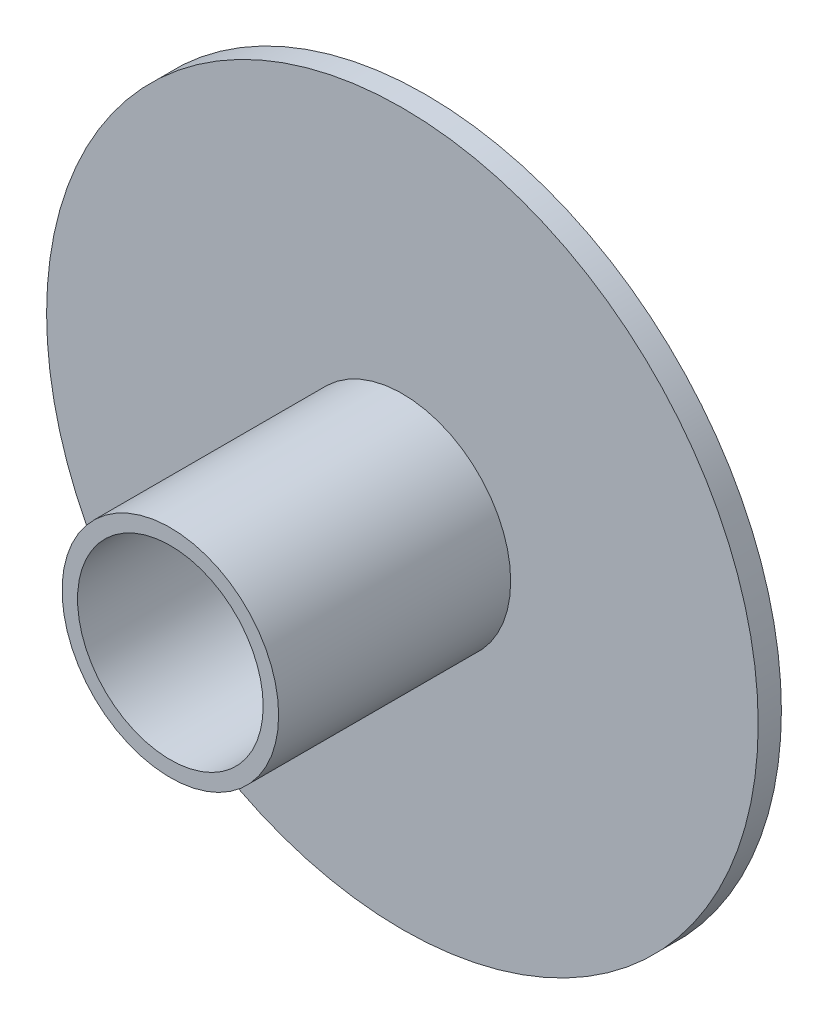
ISO-10303-21;
HEADER;
FILE_DESCRIPTION(('STEP AP214'),'2;1');
FILE_NAME('part.step','',(''),(''),'','','');
FILE_SCHEMA(('AUTOMOTIVE_DESIGN { 1 0 10303 214 1 1 1 1 }'));
ENDSEC;
DATA;
#1=APPLICATION_CONTEXT('core data for automotive mechanical design processes');
#2=APPLICATION_PROTOCOL_DEFINITION('international standard','automotive_design',2000,#1);
#3=PRODUCT_CONTEXT('',#1,'mechanical');
#4=PRODUCT('Part','Part','',(#3));
#5=PRODUCT_RELATED_PRODUCT_CATEGORY('part','',(#4));
#6=PRODUCT_DEFINITION_FORMATION('','',#4);
#7=PRODUCT_DEFINITION_CONTEXT('part definition',#1,'design');
#8=PRODUCT_DEFINITION('design','',#6,#7);
#9=PRODUCT_DEFINITION_SHAPE('','',#8);
#10=(LENGTH_UNIT() NAMED_UNIT(*) SI_UNIT(.MILLI.,.METRE.));
#11=(NAMED_UNIT(*) PLANE_ANGLE_UNIT() SI_UNIT($,.RADIAN.));
#12=(NAMED_UNIT(*) SI_UNIT($,.STERADIAN.) SOLID_ANGLE_UNIT());
#13=UNCERTAINTY_MEASURE_WITH_UNIT(LENGTH_MEASURE(1.E-05),#10,'distance_accuracy_value','');
#14=(GEOMETRIC_REPRESENTATION_CONTEXT(3) GLOBAL_UNCERTAINTY_ASSIGNED_CONTEXT((#13)) GLOBAL_UNIT_ASSIGNED_CONTEXT((#10,
#11,#12)) REPRESENTATION_CONTEXT('',''));
#15=CARTESIAN_POINT('',(0.,0.,0.));
#16=DIRECTION('',(0.,0.,1.));
#17=DIRECTION('',(1.,0.,0.));
#18=AXIS2_PLACEMENT_3D('',#15,#16,#17);
#19=CARTESIAN_POINT('',(0.,0.,1.5));
#20=DIRECTION('',(0.,0.,-1.));
#21=DIRECTION('',(-1.,0.,0.));
#22=AXIS2_PLACEMENT_3D('',#19,#20,#21);
#23=CYLINDRICAL_SURFACE('',#22,23.);
#24=CARTESIAN_POINT('',(0.,0.,1.5));
#25=DIRECTION('',(0.,0.,1.));
#26=DIRECTION('',(1.,0.,0.));
#27=AXIS2_PLACEMENT_3D('',#24,#25,#26);
#28=CIRCLE('',#27,23.);
#29=CARTESIAN_POINT('',(23.,0.,1.5));
#30=VERTEX_POINT('',#29);
#31=EDGE_CURVE('E10',#30,#30,#28,.T.);
#32=ORIENTED_EDGE('',*,*,#31,.F.);
#33=EDGE_LOOP('',(#32));
#34=FACE_BOUND('',#33,.T.);
#35=CARTESIAN_POINT('',(0.,0.,0.));
#36=DIRECTION('',(0.,0.,1.));
#37=DIRECTION('',(1.,0.,0.));
#38=AXIS2_PLACEMENT_3D('',#35,#36,#37);
#39=CIRCLE('',#38,23.);
#40=CARTESIAN_POINT('',(23.,0.,0.));
#41=VERTEX_POINT('',#40);
#42=EDGE_CURVE('E40',#41,#41,#39,.T.);
#43=ORIENTED_EDGE('',*,*,#42,.T.);
#44=EDGE_LOOP('',(#43));
#45=FACE_BOUND('',#44,.T.);
#46=ADVANCED_FACE('F33',(#34,#45),#23,.T.);
#47=CARTESIAN_POINT('',(0.,0.,1.5));
#48=DIRECTION('',(0.,0.,1.));
#49=DIRECTION('',(1.,0.,0.));
#50=AXIS2_PLACEMENT_3D('',#47,#48,#49);
#51=PLANE('',#50);
#52=CARTESIAN_POINT('',(0.,0.,1.5));
#53=DIRECTION('',(0.,0.,1.));
#54=DIRECTION('',(1.,0.,0.));
#55=AXIS2_PLACEMENT_3D('',#52,#53,#54);
#56=CIRCLE('',#55,7.);
#57=CARTESIAN_POINT('',(7.,0.,1.5));
#58=VERTEX_POINT('',#57);
#59=EDGE_CURVE('E47',#58,#58,#56,.T.);
#60=ORIENTED_EDGE('',*,*,#59,.F.);
#61=EDGE_LOOP('',(#60));
#62=FACE_BOUND('',#61,.T.);
#63=ORIENTED_EDGE('',*,*,#31,.T.);
#64=EDGE_LOOP('',(#63));
#65=FACE_BOUND('',#64,.T.);
#66=ADVANCED_FACE('F75',(#62,#65),#51,.T.);
#67=CARTESIAN_POINT('',(0.,0.,0.));
#68=DIRECTION('',(0.,0.,1.));
#69=DIRECTION('',(1.,0.,0.));
#70=AXIS2_PLACEMENT_3D('',#67,#68,#69);
#71=PLANE('',#70);
#72=CARTESIAN_POINT('',(0.,0.,0.));
#73=DIRECTION('',(0.,0.,1.));
#74=DIRECTION('',(1.,0.,0.));
#75=AXIS2_PLACEMENT_3D('',#72,#73,#74);
#76=CIRCLE('',#75,6.);
#77=CARTESIAN_POINT('',(6.,0.,0.));
#78=VERTEX_POINT('',#77);
#79=EDGE_CURVE('E52',#78,#78,#76,.T.);
#80=ORIENTED_EDGE('',*,*,#79,.T.);
#81=EDGE_LOOP('',(#80));
#82=FACE_BOUND('',#81,.T.);
#83=ORIENTED_EDGE('',*,*,#42,.F.);
#84=EDGE_LOOP('',(#83));
#85=FACE_BOUND('',#84,.T.);
#86=ADVANCED_FACE('F71',(#82,#85),#71,.F.);
#87=CARTESIAN_POINT('',(0.,0.,16.5));
#88=DIRECTION('',(0.,0.,-1.));
#89=DIRECTION('',(-1.,0.,0.));
#90=AXIS2_PLACEMENT_3D('',#87,#88,#89);
#91=CYLINDRICAL_SURFACE('',#90,7.);
#92=CARTESIAN_POINT('',(0.,0.,16.5));
#93=DIRECTION('',(0.,0.,1.));
#94=DIRECTION('',(1.,0.,0.));
#95=AXIS2_PLACEMENT_3D('',#92,#93,#94);
#96=CIRCLE('',#95,7.);
#97=CARTESIAN_POINT('',(7.,0.,16.5));
#98=VERTEX_POINT('',#97);
#99=EDGE_CURVE('E45',#98,#98,#96,.T.);
#100=ORIENTED_EDGE('',*,*,#99,.F.);
#101=EDGE_LOOP('',(#100));
#102=FACE_BOUND('',#101,.T.);
#103=ORIENTED_EDGE('',*,*,#59,.T.);
#104=EDGE_LOOP('',(#103));
#105=FACE_BOUND('',#104,.T.);
#106=ADVANCED_FACE('F65',(#102,#105),#91,.T.);
#107=CARTESIAN_POINT('',(0.,0.,16.5));
#108=DIRECTION('',(0.,0.,1.));
#109=DIRECTION('',(1.,0.,0.));
#110=AXIS2_PLACEMENT_3D('',#107,#108,#109);
#111=PLANE('',#110);
#112=CARTESIAN_POINT('',(0.,0.,16.5));
#113=DIRECTION('',(0.,0.,1.));
#114=DIRECTION('',(1.,0.,0.));
#115=AXIS2_PLACEMENT_3D('',#112,#113,#114);
#116=CIRCLE('',#115,6.);
#117=CARTESIAN_POINT('',(6.,0.,16.5));
#118=VERTEX_POINT('',#117);
#119=EDGE_CURVE('E36',#118,#118,#116,.T.);
#120=ORIENTED_EDGE('',*,*,#119,.F.);
#121=EDGE_LOOP('',(#120));
#122=FACE_BOUND('',#121,.T.);
#123=ORIENTED_EDGE('',*,*,#99,.T.);
#124=EDGE_LOOP('',(#123));
#125=FACE_BOUND('',#124,.T.);
#126=ADVANCED_FACE('F62',(#122,#125),#111,.T.);
#127=CARTESIAN_POINT('',(0.,0.,0.));
#128=DIRECTION('',(0.,0.,1.));
#129=DIRECTION('',(1.,0.,0.));
#130=AXIS2_PLACEMENT_3D('',#127,#128,#129);
#131=CYLINDRICAL_SURFACE('',#130,6.);
#132=ORIENTED_EDGE('',*,*,#119,.T.);
#133=EDGE_LOOP('',(#132));
#134=FACE_BOUND('',#133,.T.);
#135=ORIENTED_EDGE('',*,*,#79,.F.);
#136=EDGE_LOOP('',(#135));
#137=FACE_BOUND('',#136,.T.);
#138=ADVANCED_FACE('F59',(#134,#137),#131,.F.);
#139=CLOSED_SHELL('',(#46,#66,#86,#106,#126,#138));
#140=MANIFOLD_SOLID_BREP('B2',#139);
#141=ADVANCED_BREP_SHAPE_REPRESENTATION('',(#18,#140),#14);
#142=SHAPE_DEFINITION_REPRESENTATION(#9,#141);
ENDSEC;
END-ISO-10303-21;
